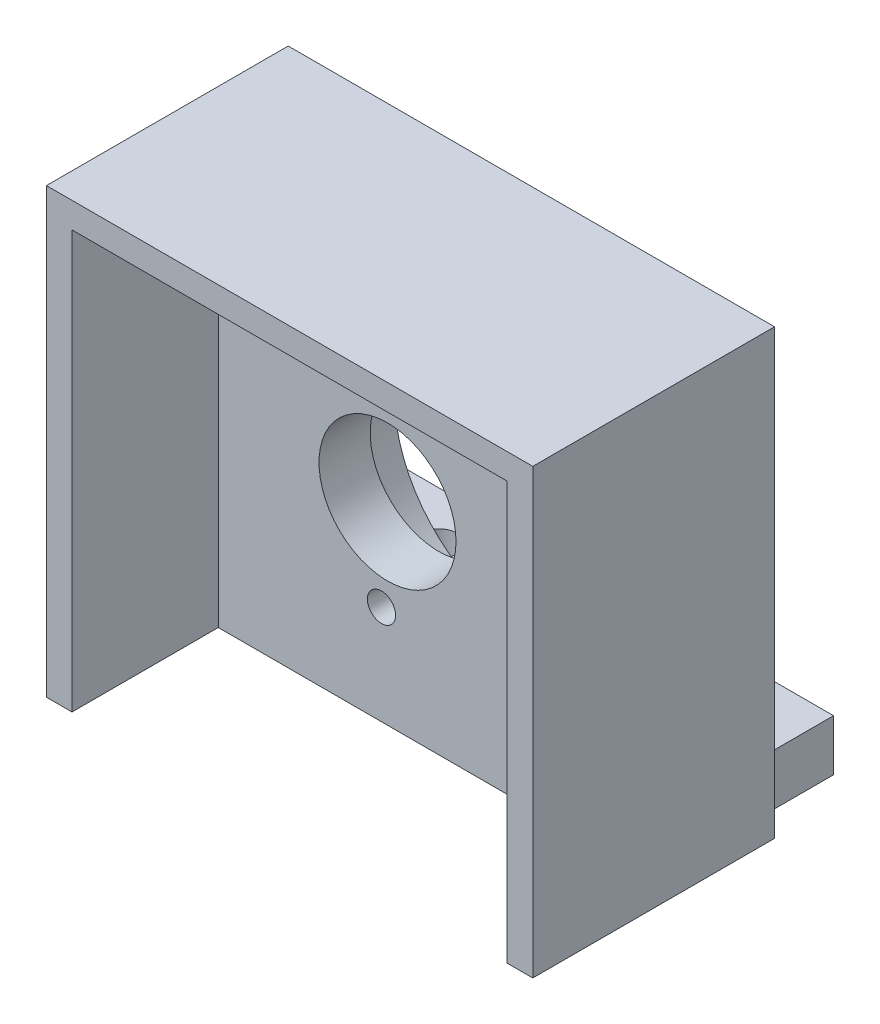
ISO-10303-21;
HEADER;
FILE_DESCRIPTION(('STEP AP214'),'2;1');
FILE_NAME('part.step','',(''),(''),'','','');
FILE_SCHEMA(('AUTOMOTIVE_DESIGN { 1 0 10303 214 1 1 1 1 }'));
ENDSEC;
DATA;
#1=APPLICATION_CONTEXT('core data for automotive mechanical design processes');
#2=APPLICATION_PROTOCOL_DEFINITION('international standard','automotive_design',2000,#1);
#3=PRODUCT_CONTEXT('',#1,'mechanical');
#4=PRODUCT('Part','Part','',(#3));
#5=PRODUCT_RELATED_PRODUCT_CATEGORY('part','',(#4));
#6=PRODUCT_DEFINITION_FORMATION('','',#4);
#7=PRODUCT_DEFINITION_CONTEXT('part definition',#1,'design');
#8=PRODUCT_DEFINITION('design','',#6,#7);
#9=PRODUCT_DEFINITION_SHAPE('','',#8);
#10=(LENGTH_UNIT() NAMED_UNIT(*) SI_UNIT(.MILLI.,.METRE.));
#11=(NAMED_UNIT(*) PLANE_ANGLE_UNIT() SI_UNIT($,.RADIAN.));
#12=(NAMED_UNIT(*) SI_UNIT($,.STERADIAN.) SOLID_ANGLE_UNIT());
#13=UNCERTAINTY_MEASURE_WITH_UNIT(LENGTH_MEASURE(1.E-05),#10,'distance_accuracy_value','');
#14=(GEOMETRIC_REPRESENTATION_CONTEXT(3) GLOBAL_UNCERTAINTY_ASSIGNED_CONTEXT((#13)) GLOBAL_UNIT_ASSIGNED_CONTEXT((#10,
#11,#12)) REPRESENTATION_CONTEXT('',''));
#15=CARTESIAN_POINT('',(0.,0.,0.));
#16=DIRECTION('',(0.,0.,1.));
#17=DIRECTION('',(1.,0.,0.));
#18=AXIS2_PLACEMENT_3D('',#15,#16,#17);
#19=CARTESIAN_POINT('',(0.,0.,3.175));
#20=DIRECTION('',(0.,0.,1.));
#21=DIRECTION('',(1.,0.,0.));
#22=AXIS2_PLACEMENT_3D('',#19,#20,#21);
#23=PLANE('',#22);
#24=CARTESIAN_POINT('',(-6.,0.,3.175));
#25=DIRECTION('',(0.,0.,1.));
#26=DIRECTION('',(1.,0.,0.));
#27=AXIS2_PLACEMENT_3D('',#24,#25,#26);
#28=CIRCLE('',#27,8.5);
#29=CARTESIAN_POINT('',(2.5,0.,3.175));
#30=VERTEX_POINT('',#29);
#31=EDGE_CURVE('E283',#30,#30,#28,.T.);
#32=ORIENTED_EDGE('',*,*,#31,.F.);
#33=EDGE_LOOP('',(#32));
#34=FACE_BOUND('',#33,.T.);
#35=CARTESIAN_POINT('',(-6.74999999999997,11.6913429510899,3.175));
#36=DIRECTION('',(0.,0.,1.));
#37=DIRECTION('',(1.,0.,0.));
#38=AXIS2_PLACEMENT_3D('',#35,#36,#37);
#39=CIRCLE('',#38,1.75);
#40=CARTESIAN_POINT('',(-4.99999999999997,11.6913429510899,3.175));
#41=VERTEX_POINT('',#40);
#42=EDGE_CURVE('E299',#41,#41,#39,.T.);
#43=ORIENTED_EDGE('',*,*,#42,.F.);
#44=EDGE_LOOP('',(#43));
#45=FACE_BOUND('',#44,.T.);
#46=CARTESIAN_POINT('',(13.5,0.,3.175));
#47=DIRECTION('',(0.,0.,1.));
#48=DIRECTION('',(1.,0.,0.));
#49=AXIS2_PLACEMENT_3D('',#46,#47,#48);
#50=CIRCLE('',#49,1.75);
#51=CARTESIAN_POINT('',(15.25,0.,3.175));
#52=VERTEX_POINT('',#51);
#53=EDGE_CURVE('E307',#52,#52,#50,.T.);
#54=ORIENTED_EDGE('',*,*,#53,.F.);
#55=EDGE_LOOP('',(#54));
#56=FACE_BOUND('',#55,.T.);
#57=CARTESIAN_POINT('',(-6.74999999999997,-11.6913429510899,3.175));
#58=DIRECTION('',(0.,0.,1.));
#59=DIRECTION('',(1.,0.,0.));
#60=AXIS2_PLACEMENT_3D('',#57,#58,#59);
#61=CIRCLE('',#60,1.75);
#62=CARTESIAN_POINT('',(-4.99999999999997,-11.6913429510899,3.175));
#63=VERTEX_POINT('',#62);
#64=EDGE_CURVE('E291',#63,#63,#61,.T.);
#65=ORIENTED_EDGE('',*,*,#64,.F.);
#66=EDGE_LOOP('',(#65));
#67=FACE_BOUND('',#66,.T.);
#68=DIRECTION('',(0.,1.,0.));
#69=VECTOR('',#68,1.);
#70=CARTESIAN_POINT('',(27.,0.,3.175));
#71=LINE('',#70,#69);
#72=CARTESIAN_POINT('',(27.,-24.,3.175));
#73=VERTEX_POINT('',#72);
#74=CARTESIAN_POINT('',(27.,27.81,3.175));
#75=VERTEX_POINT('',#74);
#76=EDGE_CURVE('E220',#73,#75,#71,.T.);
#77=ORIENTED_EDGE('',*,*,#76,.T.);
#78=DIRECTION('',(1.,0.,0.));
#79=VECTOR('',#78,1.);
#80=CARTESIAN_POINT('',(-27.,27.81,3.175));
#81=LINE('',#80,#79);
#82=CARTESIAN_POINT('',(-27.,27.81,3.175));
#83=VERTEX_POINT('',#82);
#84=EDGE_CURVE('E152',#83,#75,#81,.T.);
#85=ORIENTED_EDGE('',*,*,#84,.F.);
#86=DIRECTION('',(0.,1.,0.));
#87=VECTOR('',#86,1.);
#88=CARTESIAN_POINT('',(-27.,-24.,3.175));
#89=LINE('',#88,#87);
#90=CARTESIAN_POINT('',(-27.,-24.,3.175));
#91=VERTEX_POINT('',#90);
#92=EDGE_CURVE('E230',#91,#83,#89,.T.);
#93=ORIENTED_EDGE('',*,*,#92,.F.);
#94=DIRECTION('',(-1.,0.,0.));
#95=VECTOR('',#94,1.);
#96=CARTESIAN_POINT('',(-27.,-24.,3.175));
#97=LINE('',#96,#95);
#98=EDGE_CURVE('E233',#73,#91,#97,.T.);
#99=ORIENTED_EDGE('',*,*,#98,.F.);
#100=EDGE_LOOP('',(#77,#85,#93,#99));
#101=FACE_BOUND('',#100,.T.);
#102=ADVANCED_FACE('F41',(#34,#45,#56,#67,#101),#23,.T.);
#103=CARTESIAN_POINT('',(-24.,-24.,3.175));
#104=DIRECTION('',(0.,1.,0.));
#105=DIRECTION('',(0.,0.,1.));
#106=AXIS2_PLACEMENT_3D('',#103,#104,#105);
#107=PLANE('',#106);
#108=CARTESIAN_POINT('',(-16.,-24.,-13.175));
#109=DIRECTION('',(0.,1.,0.));
#110=DIRECTION('',(0.,0.,1.));
#111=AXIS2_PLACEMENT_3D('',#108,#109,#110);
#112=CIRCLE('',#111,2.25);
#113=CARTESIAN_POINT('',(-16.,-24.,-10.925));
#114=VERTEX_POINT('',#113);
#115=EDGE_CURVE('E274',#114,#114,#112,.T.);
#116=ORIENTED_EDGE('',*,*,#115,.T.);
#117=EDGE_LOOP('',(#116));
#118=FACE_BOUND('',#117,.T.);
#119=CARTESIAN_POINT('',(16.,-24.,-13.175));
#120=DIRECTION('',(0.,1.,0.));
#121=DIRECTION('',(0.,0.,1.));
#122=AXIS2_PLACEMENT_3D('',#119,#120,#121);
#123=CIRCLE('',#122,2.25);
#124=CARTESIAN_POINT('',(16.,-24.,-10.925));
#125=VERTEX_POINT('',#124);
#126=EDGE_CURVE('E266',#125,#125,#123,.T.);
#127=ORIENTED_EDGE('',*,*,#126,.T.);
#128=EDGE_LOOP('',(#127));
#129=FACE_BOUND('',#128,.T.);
#130=ORIENTED_EDGE('',*,*,#98,.T.);
#131=DIRECTION('',(0.,0.,-1.));
#132=VECTOR('',#131,1.);
#133=CARTESIAN_POINT('',(-27.,-24.,21.325000062));
#134=LINE('',#133,#132);
#135=CARTESIAN_POINT('',(-27.,-24.,21.325000062));
#136=VERTEX_POINT('',#135);
#137=EDGE_CURVE('E221',#136,#91,#134,.T.);
#138=ORIENTED_EDGE('',*,*,#137,.F.);
#139=DIRECTION('',(1.,0.,0.));
#140=VECTOR('',#139,1.);
#141=CARTESIAN_POINT('',(0.,-24.,21.325000062));
#142=LINE('',#141,#140);
#143=CARTESIAN_POINT('',(-30.175,-24.,21.325000062));
#144=VERTEX_POINT('',#143);
#145=EDGE_CURVE('E194',#144,#136,#142,.T.);
#146=ORIENTED_EDGE('',*,*,#145,.F.);
#147=DIRECTION('',(0.,0.,-1.));
#148=VECTOR('',#147,1.);
#149=CARTESIAN_POINT('',(-30.175,-24.,21.325000062));
#150=LINE('',#149,#148);
#151=CARTESIAN_POINT('',(-30.175,-24.,-8.674999938));
#152=VERTEX_POINT('',#151);
#153=EDGE_CURVE('E217',#144,#152,#150,.T.);
#154=ORIENTED_EDGE('',*,*,#153,.T.);
#155=DIRECTION('',(1.,0.,0.));
#156=VECTOR('',#155,1.);
#157=CARTESIAN_POINT('',(0.,-24.,-8.674999938));
#158=LINE('',#157,#156);
#159=CARTESIAN_POINT('',(-27.,-24.,-8.674999938));
#160=VERTEX_POINT('',#159);
#161=EDGE_CURVE('E186',#152,#160,#158,.T.);
#162=ORIENTED_EDGE('',*,*,#161,.T.);
#163=DIRECTION('',(0.,0.,1.));
#164=VECTOR('',#163,1.);
#165=CARTESIAN_POINT('',(-27.,-24.,-19.175));
#166=LINE('',#165,#164);
#167=CARTESIAN_POINT('',(-27.,-24.,-19.175));
#168=VERTEX_POINT('',#167);
#169=EDGE_CURVE('E254',#168,#160,#166,.T.);
#170=ORIENTED_EDGE('',*,*,#169,.F.);
#171=DIRECTION('',(1.,0.,0.));
#172=VECTOR('',#171,1.);
#173=CARTESIAN_POINT('',(-24.,-24.,-19.175));
#174=LINE('',#173,#172);
#175=CARTESIAN_POINT('',(27.,-24.,-19.175));
#176=VERTEX_POINT('',#175);
#177=EDGE_CURVE('E57',#168,#176,#174,.T.);
#178=ORIENTED_EDGE('',*,*,#177,.T.);
#179=DIRECTION('',(0.,0.,1.));
#180=VECTOR('',#179,1.);
#181=CARTESIAN_POINT('',(27.,-24.,-19.175));
#182=LINE('',#181,#180);
#183=CARTESIAN_POINT('',(27.,-24.,-8.674999938));
#184=VERTEX_POINT('',#183);
#185=EDGE_CURVE('E240',#176,#184,#182,.T.);
#186=ORIENTED_EDGE('',*,*,#185,.T.);
#187=DIRECTION('',(1.,0.,0.));
#188=VECTOR('',#187,1.);
#189=CARTESIAN_POINT('',(0.,-24.,-8.674999938));
#190=LINE('',#189,#188);
#191=CARTESIAN_POINT('',(30.175,-24.,-8.674999938));
#192=VERTEX_POINT('',#191);
#193=EDGE_CURVE('E204',#184,#192,#190,.T.);
#194=ORIENTED_EDGE('',*,*,#193,.T.);
#195=DIRECTION('',(0.,0.,-1.));
#196=VECTOR('',#195,1.);
#197=CARTESIAN_POINT('',(30.175,-24.,21.325000062));
#198=LINE('',#197,#196);
#199=CARTESIAN_POINT('',(30.175,-24.,21.325000062));
#200=VERTEX_POINT('',#199);
#201=EDGE_CURVE('E197',#200,#192,#198,.T.);
#202=ORIENTED_EDGE('',*,*,#201,.F.);
#203=DIRECTION('',(1.,0.,0.));
#204=VECTOR('',#203,1.);
#205=CARTESIAN_POINT('',(0.,-24.,21.325000062));
#206=LINE('',#205,#204);
#207=CARTESIAN_POINT('',(27.,-24.,21.325000062));
#208=VERTEX_POINT('',#207);
#209=EDGE_CURVE('E143',#208,#200,#206,.T.);
#210=ORIENTED_EDGE('',*,*,#209,.F.);
#211=DIRECTION('',(0.,0.,-1.));
#212=VECTOR('',#211,1.);
#213=CARTESIAN_POINT('',(27.,-24.,21.325000062));
#214=LINE('',#213,#212);
#215=EDGE_CURVE('E137',#208,#73,#214,.T.);
#216=ORIENTED_EDGE('',*,*,#215,.T.);
#217=EDGE_LOOP('',(#130,#138,#146,#154,#162,#170,#178,#186,#194,#202,#210,#216));
#218=FACE_BOUND('',#217,.T.);
#219=ADVANCED_FACE('F43',(#118,#129,#218),#107,.F.);
#220=CARTESIAN_POINT('',(-27.,0.,0.));
#221=DIRECTION('',(-1.,0.,0.));
#222=DIRECTION('',(0.,0.,1.));
#223=AXIS2_PLACEMENT_3D('',#220,#221,#222);
#224=PLANE('',#223);
#225=DIRECTION('',(0.,1.,0.));
#226=VECTOR('',#225,1.);
#227=CARTESIAN_POINT('',(-27.,0.,-8.674999938));
#228=LINE('',#227,#226);
#229=CARTESIAN_POINT('',(-27.,-17.65,-8.674999938));
#230=VERTEX_POINT('',#229);
#231=EDGE_CURVE('E212',#160,#230,#228,.T.);
#232=ORIENTED_EDGE('',*,*,#231,.T.);
#233=DIRECTION('',(0.,0.,-1.));
#234=VECTOR('',#233,1.);
#235=CARTESIAN_POINT('',(-27.,-17.65,-8.674999938));
#236=LINE('',#235,#234);
#237=CARTESIAN_POINT('',(-27.,-17.65,-19.175));
#238=VERTEX_POINT('',#237);
#239=EDGE_CURVE('E247',#230,#238,#236,.T.);
#240=ORIENTED_EDGE('',*,*,#239,.T.);
#241=DIRECTION('',(0.,-1.,0.));
#242=VECTOR('',#241,1.);
#243=CARTESIAN_POINT('',(-27.,-17.65,-19.175));
#244=LINE('',#243,#242);
#245=EDGE_CURVE('E251',#238,#168,#244,.T.);
#246=ORIENTED_EDGE('',*,*,#245,.T.);
#247=ORIENTED_EDGE('',*,*,#169,.T.);
#248=EDGE_LOOP('',(#232,#240,#246,#247));
#249=FACE_BOUND('',#248,.T.);
#250=ADVANCED_FACE('F324',(#249),#224,.T.);
#251=CARTESIAN_POINT('',(27.,0.,0.));
#252=DIRECTION('',(1.,0.,0.));
#253=DIRECTION('',(0.,0.,1.));
#254=AXIS2_PLACEMENT_3D('',#251,#252,#253);
#255=PLANE('',#254);
#256=DIRECTION('',(0.,-1.,0.));
#257=VECTOR('',#256,1.);
#258=CARTESIAN_POINT('',(27.,0.,-8.674999938));
#259=LINE('',#258,#257);
#260=CARTESIAN_POINT('',(27.,-17.65,-8.674999938));
#261=VERTEX_POINT('',#260);
#262=EDGE_CURVE('E208',#261,#184,#259,.T.);
#263=ORIENTED_EDGE('',*,*,#262,.T.);
#264=ORIENTED_EDGE('',*,*,#185,.F.);
#265=DIRECTION('',(0.,-1.,0.));
#266=VECTOR('',#265,1.);
#267=CARTESIAN_POINT('',(27.,-17.65,-19.175));
#268=LINE('',#267,#266);
#269=CARTESIAN_POINT('',(27.,-17.65,-19.175));
#270=VERTEX_POINT('',#269);
#271=EDGE_CURVE('E244',#270,#176,#268,.T.);
#272=ORIENTED_EDGE('',*,*,#271,.F.);
#273=DIRECTION('',(0.,0.,-1.));
#274=VECTOR('',#273,1.);
#275=CARTESIAN_POINT('',(27.,-17.65,-8.674999938));
#276=LINE('',#275,#274);
#277=EDGE_CURVE('E237',#261,#270,#276,.T.);
#278=ORIENTED_EDGE('',*,*,#277,.F.);
#279=EDGE_LOOP('',(#263,#264,#272,#278));
#280=FACE_BOUND('',#279,.T.);
#281=ADVANCED_FACE('F343',(#280),#255,.T.);
#282=CARTESIAN_POINT('',(0.,0.,-3.175));
#283=DIRECTION('',(0.,0.,1.));
#284=DIRECTION('',(1.,0.,0.));
#285=AXIS2_PLACEMENT_3D('',#282,#283,#284);
#286=PLANE('',#285);
#287=CARTESIAN_POINT('',(13.5,0.,-3.175));
#288=DIRECTION('',(0.,0.,1.));
#289=DIRECTION('',(1.,0.,0.));
#290=AXIS2_PLACEMENT_3D('',#287,#288,#289);
#291=CIRCLE('',#290,1.75);
#292=CARTESIAN_POINT('',(15.25,0.,-3.175));
#293=VERTEX_POINT('',#292);
#294=EDGE_CURVE('E303',#293,#293,#291,.T.);
#295=ORIENTED_EDGE('',*,*,#294,.T.);
#296=EDGE_LOOP('',(#295));
#297=FACE_BOUND('',#296,.T.);
#298=CARTESIAN_POINT('',(-6.74999999999997,11.6913429510899,-3.175));
#299=DIRECTION('',(0.,0.,1.));
#300=DIRECTION('',(1.,0.,0.));
#301=AXIS2_PLACEMENT_3D('',#298,#299,#300);
#302=CIRCLE('',#301,1.75);
#303=CARTESIAN_POINT('',(-4.99999999999997,11.6913429510899,-3.175));
#304=VERTEX_POINT('',#303);
#305=EDGE_CURVE('E295',#304,#304,#302,.T.);
#306=ORIENTED_EDGE('',*,*,#305,.T.);
#307=EDGE_LOOP('',(#306));
#308=FACE_BOUND('',#307,.T.);
#309=CARTESIAN_POINT('',(-6.74999999999997,-11.6913429510899,-3.175));
#310=DIRECTION('',(0.,0.,1.));
#311=DIRECTION('',(1.,0.,0.));
#312=AXIS2_PLACEMENT_3D('',#309,#310,#311);
#313=CIRCLE('',#312,1.75);
#314=CARTESIAN_POINT('',(-4.99999999999997,-11.6913429510899,-3.175));
#315=VERTEX_POINT('',#314);
#316=EDGE_CURVE('E287',#315,#315,#313,.T.);
#317=ORIENTED_EDGE('',*,*,#316,.T.);
#318=EDGE_LOOP('',(#317));
#319=FACE_BOUND('',#318,.T.);
#320=CARTESIAN_POINT('',(-6.,0.,-3.175));
#321=DIRECTION('',(0.,0.,1.));
#322=DIRECTION('',(1.,0.,0.));
#323=AXIS2_PLACEMENT_3D('',#320,#321,#322);
#324=CIRCLE('',#323,8.5);
#325=CARTESIAN_POINT('',(2.5,0.,-3.175));
#326=VERTEX_POINT('',#325);
#327=EDGE_CURVE('E282',#326,#326,#324,.T.);
#328=ORIENTED_EDGE('',*,*,#327,.T.);
#329=EDGE_LOOP('',(#328));
#330=FACE_BOUND('',#329,.T.);
#331=CARTESIAN_POINT('',(0.,0.,-3.175));
#332=DIRECTION('',(0.,0.,1.));
#333=DIRECTION('',(1.,0.,0.));
#334=AXIS2_PLACEMENT_3D('',#331,#332,#333);
#335=CIRCLE('',#334,17.);
#336=CARTESIAN_POINT('',(17.,0.,-3.175));
#337=VERTEX_POINT('',#336);
#338=EDGE_CURVE('E11',#337,#337,#335,.T.);
#339=ORIENTED_EDGE('',*,*,#338,.F.);
#340=EDGE_LOOP('',(#339));
#341=FACE_BOUND('',#340,.T.);
#342=ADVANCED_FACE('F372',(#297,#308,#319,#330,#341),#286,.F.);
#343=CARTESIAN_POINT('',(13.5,0.,3.175));
#344=DIRECTION('',(0.,0.,-1.));
#345=DIRECTION('',(-1.,0.,0.));
#346=AXIS2_PLACEMENT_3D('',#343,#344,#345);
#347=CYLINDRICAL_SURFACE('',#346,1.75);
#348=ORIENTED_EDGE('',*,*,#53,.T.);
#349=EDGE_LOOP('',(#348));
#350=FACE_BOUND('',#349,.T.);
#351=ORIENTED_EDGE('',*,*,#294,.F.);
#352=EDGE_LOOP('',(#351));
#353=FACE_BOUND('',#352,.T.);
#354=ADVANCED_FACE('F370',(#350,#353),#347,.F.);
#355=CARTESIAN_POINT('',(-6.74999999999997,11.6913429510899,3.175));
#356=DIRECTION('',(0.,0.,-1.));
#357=DIRECTION('',(-1.,0.,0.));
#358=AXIS2_PLACEMENT_3D('',#355,#356,#357);
#359=CYLINDRICAL_SURFACE('',#358,1.75);
#360=ORIENTED_EDGE('',*,*,#42,.T.);
#361=EDGE_LOOP('',(#360));
#362=FACE_BOUND('',#361,.T.);
#363=ORIENTED_EDGE('',*,*,#305,.F.);
#364=EDGE_LOOP('',(#363));
#365=FACE_BOUND('',#364,.T.);
#366=ADVANCED_FACE('F379',(#362,#365),#359,.F.);
#367=CARTESIAN_POINT('',(-6.74999999999997,-11.6913429510899,3.175));
#368=DIRECTION('',(0.,0.,-1.));
#369=DIRECTION('',(-1.,0.,0.));
#370=AXIS2_PLACEMENT_3D('',#367,#368,#369);
#371=CYLINDRICAL_SURFACE('',#370,1.75);
#372=ORIENTED_EDGE('',*,*,#64,.T.);
#373=EDGE_LOOP('',(#372));
#374=FACE_BOUND('',#373,.T.);
#375=ORIENTED_EDGE('',*,*,#316,.F.);
#376=EDGE_LOOP('',(#375));
#377=FACE_BOUND('',#376,.T.);
#378=ADVANCED_FACE('F410',(#374,#377),#371,.F.);
#379=CARTESIAN_POINT('',(-6.,0.,3.175));
#380=DIRECTION('',(0.,0.,-1.));
#381=DIRECTION('',(-1.,0.,0.));
#382=AXIS2_PLACEMENT_3D('',#379,#380,#381);
#383=CYLINDRICAL_SURFACE('',#382,8.5);
#384=ORIENTED_EDGE('',*,*,#31,.T.);
#385=EDGE_LOOP('',(#384));
#386=FACE_BOUND('',#385,.T.);
#387=ORIENTED_EDGE('',*,*,#327,.F.);
#388=EDGE_LOOP('',(#387));
#389=FACE_BOUND('',#388,.T.);
#390=ADVANCED_FACE('F406',(#386,#389),#383,.F.);
#391=CARTESIAN_POINT('',(-39.3727843932061,-17.65,-3.175));
#392=DIRECTION('',(0.,1.,0.));
#393=DIRECTION('',(0.,0.,1.));
#394=AXIS2_PLACEMENT_3D('',#391,#392,#393);
#395=PLANE('',#394);
#396=CARTESIAN_POINT('',(16.,-17.65,-13.175));
#397=DIRECTION('',(0.,1.,0.));
#398=DIRECTION('',(0.,0.,1.));
#399=AXIS2_PLACEMENT_3D('',#396,#397,#398);
#400=CIRCLE('',#399,2.25);
#401=CARTESIAN_POINT('',(16.,-17.65,-10.925));
#402=VERTEX_POINT('',#401);
#403=EDGE_CURVE('E262',#402,#402,#400,.T.);
#404=ORIENTED_EDGE('',*,*,#403,.F.);
#405=EDGE_LOOP('',(#404));
#406=FACE_BOUND('',#405,.T.);
#407=CARTESIAN_POINT('',(-16.,-17.65,-13.175));
#408=DIRECTION('',(0.,1.,0.));
#409=DIRECTION('',(0.,0.,1.));
#410=AXIS2_PLACEMENT_3D('',#407,#408,#409);
#411=CIRCLE('',#410,2.25);
#412=CARTESIAN_POINT('',(-16.,-17.65,-10.925));
#413=VERTEX_POINT('',#412);
#414=EDGE_CURVE('E270',#413,#413,#411,.T.);
#415=ORIENTED_EDGE('',*,*,#414,.F.);
#416=EDGE_LOOP('',(#415));
#417=FACE_BOUND('',#416,.T.);
#418=DIRECTION('',(-1.,0.,0.));
#419=VECTOR('',#418,1.);
#420=CARTESIAN_POINT('',(-39.3727843932061,-17.65,-8.674999938));
#421=LINE('',#420,#419);
#422=EDGE_CURVE('E50',#261,#230,#421,.T.);
#423=ORIENTED_EDGE('',*,*,#422,.F.);
#424=ORIENTED_EDGE('',*,*,#277,.T.);
#425=DIRECTION('',(-1.,0.,0.));
#426=VECTOR('',#425,1.);
#427=CARTESIAN_POINT('',(24.,-17.65,-19.175));
#428=LINE('',#427,#426);
#429=EDGE_CURVE('E65',#270,#238,#428,.T.);
#430=ORIENTED_EDGE('',*,*,#429,.T.);
#431=ORIENTED_EDGE('',*,*,#239,.F.);
#432=EDGE_LOOP('',(#423,#424,#430,#431));
#433=FACE_BOUND('',#432,.T.);
#434=ADVANCED_FACE('F322',(#406,#417,#433),#395,.T.);
#435=CARTESIAN_POINT('',(0.,0.,-8.674999938));
#436=DIRECTION('',(0.,0.,-1.));
#437=DIRECTION('',(1.,0.,0.));
#438=AXIS2_PLACEMENT_3D('',#435,#436,#437);
#439=PLANE('',#438);
#440=DIRECTION('',(0.,1.,0.));
#441=VECTOR('',#440,1.);
#442=CARTESIAN_POINT('',(-30.175,0.,-8.674999938));
#443=LINE('',#442,#441);
#444=CARTESIAN_POINT('',(-30.175,30.985,-8.674999938));
#445=VERTEX_POINT('',#444);
#446=EDGE_CURVE('E181',#152,#445,#443,.T.);
#447=ORIENTED_EDGE('',*,*,#446,.T.);
#448=DIRECTION('',(-1.,0.,0.));
#449=VECTOR('',#448,1.);
#450=CARTESIAN_POINT('',(30.175,30.985,-8.674999938));
#451=LINE('',#450,#449);
#452=CARTESIAN_POINT('',(30.175,30.985,-8.674999938));
#453=VERTEX_POINT('',#452);
#454=EDGE_CURVE('E173',#453,#445,#451,.T.);
#455=ORIENTED_EDGE('',*,*,#454,.F.);
#456=DIRECTION('',(0.,-1.,0.));
#457=VECTOR('',#456,1.);
#458=CARTESIAN_POINT('',(30.175,0.,-8.674999938));
#459=LINE('',#458,#457);
#460=EDGE_CURVE('E200',#453,#192,#459,.T.);
#461=ORIENTED_EDGE('',*,*,#460,.T.);
#462=ORIENTED_EDGE('',*,*,#193,.F.);
#463=ORIENTED_EDGE('',*,*,#262,.F.);
#464=ORIENTED_EDGE('',*,*,#422,.T.);
#465=ORIENTED_EDGE('',*,*,#231,.F.);
#466=ORIENTED_EDGE('',*,*,#161,.F.);
#467=EDGE_LOOP('',(#447,#455,#461,#462,#463,#464,#465,#466));
#468=FACE_BOUND('',#467,.T.);
#469=CARTESIAN_POINT('',(0.,0.,-8.674999938));
#470=DIRECTION('',(0.,0.,1.));
#471=DIRECTION('',(1.,0.,0.));
#472=AXIS2_PLACEMENT_3D('',#469,#470,#471);
#473=CIRCLE('',#472,17.);
#474=CARTESIAN_POINT('',(17.,0.,-8.674999938));
#475=VERTEX_POINT('',#474);
#476=EDGE_CURVE('E278',#475,#475,#473,.T.);
#477=ORIENTED_EDGE('',*,*,#476,.T.);
#478=EDGE_LOOP('',(#477));
#479=FACE_BOUND('',#478,.T.);
#480=ADVANCED_FACE('F318',(#468,#479),#439,.T.);
#481=CARTESIAN_POINT('',(0.,0.,-8.674999938));
#482=DIRECTION('',(0.,0.,1.));
#483=DIRECTION('',(1.,0.,0.));
#484=AXIS2_PLACEMENT_3D('',#481,#482,#483);
#485=CYLINDRICAL_SURFACE('',#484,17.);
#486=ORIENTED_EDGE('',*,*,#476,.F.);
#487=EDGE_LOOP('',(#486));
#488=FACE_BOUND('',#487,.T.);
#489=ORIENTED_EDGE('',*,*,#338,.T.);
#490=EDGE_LOOP('',(#489));
#491=FACE_BOUND('',#490,.T.);
#492=ADVANCED_FACE('F392',(#488,#491),#485,.F.);
#493=CARTESIAN_POINT('',(-16.,-17.65,-13.175));
#494=DIRECTION('',(0.,1.,0.));
#495=DIRECTION('',(0.,0.,1.));
#496=AXIS2_PLACEMENT_3D('',#493,#494,#495);
#497=CYLINDRICAL_SURFACE('',#496,2.25);
#498=ORIENTED_EDGE('',*,*,#115,.F.);
#499=EDGE_LOOP('',(#498));
#500=FACE_BOUND('',#499,.T.);
#501=ORIENTED_EDGE('',*,*,#414,.T.);
#502=EDGE_LOOP('',(#501));
#503=FACE_BOUND('',#502,.T.);
#504=ADVANCED_FACE('F356',(#500,#503),#497,.F.);
#505=CARTESIAN_POINT('',(16.,-17.65,-13.175));
#506=DIRECTION('',(0.,1.,0.));
#507=DIRECTION('',(0.,0.,1.));
#508=AXIS2_PLACEMENT_3D('',#505,#506,#507);
#509=CYLINDRICAL_SURFACE('',#508,2.25);
#510=ORIENTED_EDGE('',*,*,#126,.F.);
#511=EDGE_LOOP('',(#510));
#512=FACE_BOUND('',#511,.T.);
#513=ORIENTED_EDGE('',*,*,#403,.T.);
#514=EDGE_LOOP('',(#513));
#515=FACE_BOUND('',#514,.T.);
#516=ADVANCED_FACE('F347',(#512,#515),#509,.F.);
#517=CARTESIAN_POINT('',(0.,0.,-19.175));
#518=DIRECTION('',(0.,0.,-1.));
#519=DIRECTION('',(1.,0.,0.));
#520=AXIS2_PLACEMENT_3D('',#517,#518,#519);
#521=PLANE('',#520);
#522=ORIENTED_EDGE('',*,*,#429,.F.);
#523=ORIENTED_EDGE('',*,*,#271,.T.);
#524=ORIENTED_EDGE('',*,*,#177,.F.);
#525=ORIENTED_EDGE('',*,*,#245,.F.);
#526=EDGE_LOOP('',(#522,#523,#524,#525));
#527=FACE_BOUND('',#526,.T.);
#528=ADVANCED_FACE('F345',(#527),#521,.T.);
#529=CARTESIAN_POINT('',(-30.175,0.,21.325000062));
#530=DIRECTION('',(-1.,0.,0.));
#531=DIRECTION('',(0.,0.,1.));
#532=AXIS2_PLACEMENT_3D('',#529,#530,#531);
#533=PLANE('',#532);
#534=ORIENTED_EDGE('',*,*,#446,.F.);
#535=ORIENTED_EDGE('',*,*,#153,.F.);
#536=DIRECTION('',(0.,1.,0.));
#537=VECTOR('',#536,1.);
#538=CARTESIAN_POINT('',(-30.175,0.,21.325000062));
#539=LINE('',#538,#537);
#540=CARTESIAN_POINT('',(-30.175,30.985,21.325000062));
#541=VERTEX_POINT('',#540);
#542=EDGE_CURVE('E182',#144,#541,#539,.T.);
#543=ORIENTED_EDGE('',*,*,#542,.T.);
#544=DIRECTION('',(0.,0.,1.));
#545=VECTOR('',#544,1.);
#546=CARTESIAN_POINT('',(-30.175,30.985,-8.674999938));
#547=LINE('',#546,#545);
#548=EDGE_CURVE('E177',#445,#541,#547,.T.);
#549=ORIENTED_EDGE('',*,*,#548,.F.);
#550=EDGE_LOOP('',(#534,#535,#543,#549));
#551=FACE_BOUND('',#550,.T.);
#552=ADVANCED_FACE('F333',(#551),#533,.T.);
#553=CARTESIAN_POINT('',(-27.,0.,21.325000062));
#554=DIRECTION('',(-1.,0.,0.));
#555=DIRECTION('',(0.,0.,1.));
#556=AXIS2_PLACEMENT_3D('',#553,#554,#555);
#557=PLANE('',#556);
#558=ORIENTED_EDGE('',*,*,#92,.T.);
#559=DIRECTION('',(0.,0.,1.));
#560=VECTOR('',#559,1.);
#561=CARTESIAN_POINT('',(-27.,27.81,-51.7724803789946));
#562=LINE('',#561,#560);
#563=CARTESIAN_POINT('',(-27.,27.81,21.325000062));
#564=VERTEX_POINT('',#563);
#565=EDGE_CURVE('E154',#83,#564,#562,.T.);
#566=ORIENTED_EDGE('',*,*,#565,.T.);
#567=DIRECTION('',(0.,1.,0.));
#568=VECTOR('',#567,1.);
#569=CARTESIAN_POINT('',(-27.,0.,21.325000062));
#570=LINE('',#569,#568);
#571=EDGE_CURVE('E142',#136,#564,#570,.T.);
#572=ORIENTED_EDGE('',*,*,#571,.F.);
#573=ORIENTED_EDGE('',*,*,#137,.T.);
#574=EDGE_LOOP('',(#558,#566,#572,#573));
#575=FACE_BOUND('',#574,.T.);
#576=ADVANCED_FACE('F354',(#575),#557,.F.);
#577=CARTESIAN_POINT('',(27.,0.,21.325000062));
#578=DIRECTION('',(1.,0.,0.));
#579=DIRECTION('',(0.,0.,-1.));
#580=AXIS2_PLACEMENT_3D('',#577,#578,#579);
#581=PLANE('',#580);
#582=ORIENTED_EDGE('',*,*,#76,.F.);
#583=ORIENTED_EDGE('',*,*,#215,.F.);
#584=DIRECTION('',(0.,-1.,0.));
#585=VECTOR('',#584,1.);
#586=CARTESIAN_POINT('',(27.,0.,21.325000062));
#587=LINE('',#586,#585);
#588=CARTESIAN_POINT('',(27.,27.81,21.325000062));
#589=VERTEX_POINT('',#588);
#590=EDGE_CURVE('E132',#589,#208,#587,.T.);
#591=ORIENTED_EDGE('',*,*,#590,.F.);
#592=DIRECTION('',(0.,0.,1.));
#593=VECTOR('',#592,1.);
#594=CARTESIAN_POINT('',(27.,27.81,-51.7724803789946));
#595=LINE('',#594,#593);
#596=EDGE_CURVE('E135',#75,#589,#595,.T.);
#597=ORIENTED_EDGE('',*,*,#596,.F.);
#598=EDGE_LOOP('',(#582,#583,#591,#597));
#599=FACE_BOUND('',#598,.T.);
#600=ADVANCED_FACE('F134',(#599),#581,.F.);
#601=CARTESIAN_POINT('',(30.175,0.,21.325000062));
#602=DIRECTION('',(1.,0.,0.));
#603=DIRECTION('',(0.,0.,-1.));
#604=AXIS2_PLACEMENT_3D('',#601,#602,#603);
#605=PLANE('',#604);
#606=ORIENTED_EDGE('',*,*,#460,.F.);
#607=DIRECTION('',(0.,0.,-1.));
#608=VECTOR('',#607,1.);
#609=CARTESIAN_POINT('',(30.175,30.985,21.325000062));
#610=LINE('',#609,#608);
#611=CARTESIAN_POINT('',(30.175,30.985,21.325000062));
#612=VERTEX_POINT('',#611);
#613=EDGE_CURVE('E169',#612,#453,#610,.T.);
#614=ORIENTED_EDGE('',*,*,#613,.F.);
#615=DIRECTION('',(0.,-1.,0.));
#616=VECTOR('',#615,1.);
#617=CARTESIAN_POINT('',(30.175,0.,21.325000062));
#618=LINE('',#617,#616);
#619=EDGE_CURVE('E185',#612,#200,#618,.T.);
#620=ORIENTED_EDGE('',*,*,#619,.T.);
#621=ORIENTED_EDGE('',*,*,#201,.T.);
#622=EDGE_LOOP('',(#606,#614,#620,#621));
#623=FACE_BOUND('',#622,.T.);
#624=ADVANCED_FACE('F341',(#623),#605,.T.);
#625=CARTESIAN_POINT('',(0.,0.,21.325000062));
#626=DIRECTION('',(0.,0.,-1.));
#627=DIRECTION('',(-1.,0.,0.));
#628=AXIS2_PLACEMENT_3D('',#625,#626,#627);
#629=PLANE('',#628);
#630=ORIENTED_EDGE('',*,*,#571,.T.);
#631=DIRECTION('',(-1.,0.,0.));
#632=VECTOR('',#631,1.);
#633=CARTESIAN_POINT('',(-27.,27.81,21.325000062));
#634=LINE('',#633,#632);
#635=EDGE_CURVE('E150',#589,#564,#634,.T.);
#636=ORIENTED_EDGE('',*,*,#635,.F.);
#637=ORIENTED_EDGE('',*,*,#590,.T.);
#638=ORIENTED_EDGE('',*,*,#209,.T.);
#639=ORIENTED_EDGE('',*,*,#619,.F.);
#640=DIRECTION('',(1.,0.,0.));
#641=VECTOR('',#640,1.);
#642=CARTESIAN_POINT('',(-30.175,30.985,21.325000062));
#643=LINE('',#642,#641);
#644=EDGE_CURVE('E165',#541,#612,#643,.T.);
#645=ORIENTED_EDGE('',*,*,#644,.F.);
#646=ORIENTED_EDGE('',*,*,#542,.F.);
#647=ORIENTED_EDGE('',*,*,#145,.T.);
#648=EDGE_LOOP('',(#630,#636,#637,#638,#639,#645,#646,#647));
#649=FACE_BOUND('',#648,.T.);
#650=ADVANCED_FACE('F156',(#649),#629,.F.);
#651=CARTESIAN_POINT('',(0.,30.985,0.));
#652=DIRECTION('',(0.,1.,0.));
#653=DIRECTION('',(-1.,0.,0.));
#654=AXIS2_PLACEMENT_3D('',#651,#652,#653);
#655=PLANE('',#654);
#656=ORIENTED_EDGE('',*,*,#644,.T.);
#657=ORIENTED_EDGE('',*,*,#613,.T.);
#658=ORIENTED_EDGE('',*,*,#454,.T.);
#659=ORIENTED_EDGE('',*,*,#548,.T.);
#660=EDGE_LOOP('',(#656,#657,#658,#659));
#661=FACE_BOUND('',#660,.T.);
#662=ADVANCED_FACE('F337',(#661),#655,.T.);
#663=CARTESIAN_POINT('',(-27.,27.81,-51.7724803789946));
#664=DIRECTION('',(0.,1.,0.));
#665=DIRECTION('',(0.,0.,1.));
#666=AXIS2_PLACEMENT_3D('',#663,#664,#665);
#667=PLANE('',#666);
#668=ORIENTED_EDGE('',*,*,#84,.T.);
#669=ORIENTED_EDGE('',*,*,#596,.T.);
#670=ORIENTED_EDGE('',*,*,#635,.T.);
#671=ORIENTED_EDGE('',*,*,#565,.F.);
#672=EDGE_LOOP('',(#668,#669,#670,#671));
#673=FACE_BOUND('',#672,.T.);
#674=ADVANCED_FACE('F148',(#673),#667,.F.);
#675=CLOSED_SHELL('',(#102,#219,#250,#281,#342,#354,#366,#378,#390,#434,#480,#492,#504,#516,
#528,#552,#576,#600,#624,#650,#662,#674));
#676=MANIFOLD_SOLID_BREP('B2',#675);
#677=ADVANCED_BREP_SHAPE_REPRESENTATION('',(#18,#676),#14);
#678=SHAPE_DEFINITION_REPRESENTATION(#9,#677);
ENDSEC;
END-ISO-10303-21;
